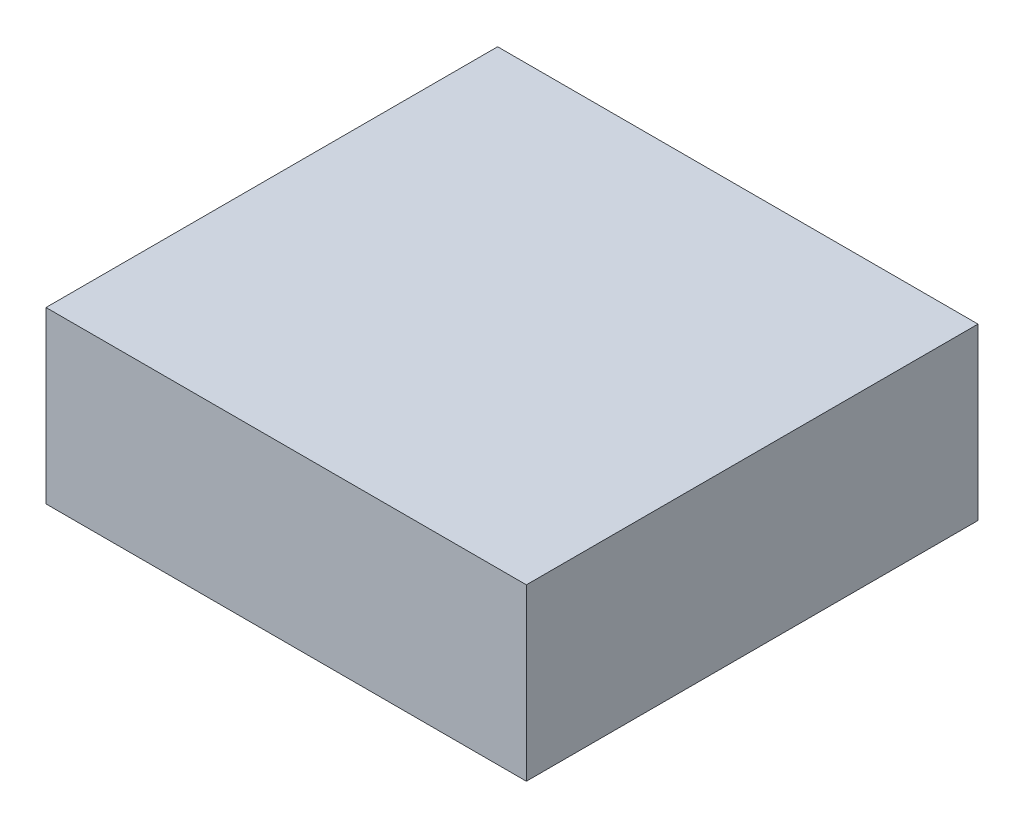
ISO-10303-21;
HEADER;
FILE_DESCRIPTION(('STEP AP214'),'2;1');
FILE_NAME('part.step','',(''),(''),'','','');
FILE_SCHEMA(('AUTOMOTIVE_DESIGN { 1 0 10303 214 1 1 1 1 }'));
ENDSEC;
DATA;
#1=APPLICATION_CONTEXT('core data for automotive mechanical design processes');
#2=APPLICATION_PROTOCOL_DEFINITION('international standard','automotive_design',2000,#1);
#3=PRODUCT_CONTEXT('',#1,'mechanical');
#4=PRODUCT('Part','Part','',(#3));
#5=PRODUCT_RELATED_PRODUCT_CATEGORY('part','',(#4));
#6=PRODUCT_DEFINITION_FORMATION('','',#4);
#7=PRODUCT_DEFINITION_CONTEXT('part definition',#1,'design');
#8=PRODUCT_DEFINITION('design','',#6,#7);
#9=PRODUCT_DEFINITION_SHAPE('','',#8);
#10=(LENGTH_UNIT() NAMED_UNIT(*) SI_UNIT(.MILLI.,.METRE.));
#11=(NAMED_UNIT(*) PLANE_ANGLE_UNIT() SI_UNIT($,.RADIAN.));
#12=(NAMED_UNIT(*) SI_UNIT($,.STERADIAN.) SOLID_ANGLE_UNIT());
#13=UNCERTAINTY_MEASURE_WITH_UNIT(LENGTH_MEASURE(1.E-05),#10,'distance_accuracy_value','');
#14=(GEOMETRIC_REPRESENTATION_CONTEXT(3) GLOBAL_UNCERTAINTY_ASSIGNED_CONTEXT((#13)) GLOBAL_UNIT_ASSIGNED_CONTEXT((#10,
#11,#12)) REPRESENTATION_CONTEXT('',''));
#15=CARTESIAN_POINT('',(0.,0.,0.));
#16=DIRECTION('',(0.,0.,1.));
#17=DIRECTION('',(1.,0.,0.));
#18=AXIS2_PLACEMENT_3D('',#15,#16,#17);
#19=CARTESIAN_POINT('',(53.1815925286087,-18.8342802614234,-50.));
#20=DIRECTION('',(1.,0.,0.));
#21=DIRECTION('',(0.,0.,-1.));
#22=AXIS2_PLACEMENT_3D('',#19,#20,#21);
#23=PLANE('',#22);
#24=DIRECTION('',(0.,1.,0.));
#25=VECTOR('',#24,1.);
#26=CARTESIAN_POINT('',(53.1815925286087,-18.8342802614234,50.));
#27=LINE('',#26,#25);
#28=CARTESIAN_POINT('',(53.1815925286087,-18.8342802614234,50.));
#29=VERTEX_POINT('',#28);
#30=CARTESIAN_POINT('',(53.1815925286087,18.8342802614234,50.));
#31=VERTEX_POINT('',#30);
#32=EDGE_CURVE('E104',#29,#31,#27,.T.);
#33=ORIENTED_EDGE('',*,*,#32,.F.);
#34=DIRECTION('',(0.,0.,1.));
#35=VECTOR('',#34,1.);
#36=CARTESIAN_POINT('',(53.1815925286087,-18.8342802614234,-50.));
#37=LINE('',#36,#35);
#38=CARTESIAN_POINT('',(53.1815925286087,-18.8342802614234,-50.));
#39=VERTEX_POINT('',#38);
#40=EDGE_CURVE('E11',#39,#29,#37,.T.);
#41=ORIENTED_EDGE('',*,*,#40,.F.);
#42=DIRECTION('',(0.,1.,0.));
#43=VECTOR('',#42,1.);
#44=CARTESIAN_POINT('',(53.1815925286087,-18.8342802614234,-50.));
#45=LINE('',#44,#43);
#46=CARTESIAN_POINT('',(53.1815925286087,18.8342802614234,-50.));
#47=VERTEX_POINT('',#46);
#48=EDGE_CURVE('E98',#39,#47,#45,.T.);
#49=ORIENTED_EDGE('',*,*,#48,.T.);
#50=DIRECTION('',(0.,0.,1.));
#51=VECTOR('',#50,1.);
#52=CARTESIAN_POINT('',(53.1815925286087,18.8342802614234,-50.));
#53=LINE('',#52,#51);
#54=EDGE_CURVE('E43',#47,#31,#53,.T.);
#55=ORIENTED_EDGE('',*,*,#54,.T.);
#56=EDGE_LOOP('',(#33,#41,#49,#55));
#57=FACE_BOUND('',#56,.T.);
#58=ADVANCED_FACE('F40',(#57),#23,.T.);
#59=CARTESIAN_POINT('',(-53.1815925286088,-18.8342802614234,-50.));
#60=DIRECTION('',(0.,-1.,0.));
#61=DIRECTION('',(0.,0.,-1.));
#62=AXIS2_PLACEMENT_3D('',#59,#60,#61);
#63=PLANE('',#62);
#64=DIRECTION('',(1.,0.,0.));
#65=VECTOR('',#64,1.);
#66=CARTESIAN_POINT('',(-53.1815925286088,-18.8342802614234,50.));
#67=LINE('',#66,#65);
#68=CARTESIAN_POINT('',(-53.1815925286088,-18.8342802614234,50.));
#69=VERTEX_POINT('',#68);
#70=EDGE_CURVE('E100',#69,#29,#67,.T.);
#71=ORIENTED_EDGE('',*,*,#70,.F.);
#72=DIRECTION('',(0.,0.,1.));
#73=VECTOR('',#72,1.);
#74=CARTESIAN_POINT('',(-53.1815925286088,-18.8342802614234,-50.));
#75=LINE('',#74,#73);
#76=CARTESIAN_POINT('',(-53.1815925286088,-18.8342802614234,-50.));
#77=VERTEX_POINT('',#76);
#78=EDGE_CURVE('E49',#77,#69,#75,.T.);
#79=ORIENTED_EDGE('',*,*,#78,.F.);
#80=DIRECTION('',(1.,0.,0.));
#81=VECTOR('',#80,1.);
#82=CARTESIAN_POINT('',(-53.1815925286088,-18.8342802614234,-50.));
#83=LINE('',#82,#81);
#84=EDGE_CURVE('E95',#77,#39,#83,.T.);
#85=ORIENTED_EDGE('',*,*,#84,.T.);
#86=ORIENTED_EDGE('',*,*,#40,.T.);
#87=EDGE_LOOP('',(#71,#79,#85,#86));
#88=FACE_BOUND('',#87,.T.);
#89=ADVANCED_FACE('F114',(#88),#63,.T.);
#90=CARTESIAN_POINT('',(-53.1815925286088,-18.8342802614234,-50.));
#91=DIRECTION('',(-1.,0.,0.));
#92=DIRECTION('',(0.,0.,1.));
#93=AXIS2_PLACEMENT_3D('',#90,#91,#92);
#94=PLANE('',#93);
#95=DIRECTION('',(0.,-1.,0.));
#96=VECTOR('',#95,1.);
#97=CARTESIAN_POINT('',(-53.1815925286088,-18.8342802614234,50.));
#98=LINE('',#97,#96);
#99=CARTESIAN_POINT('',(-53.1815925286088,18.8342802614234,50.));
#100=VERTEX_POINT('',#99);
#101=EDGE_CURVE('E90',#100,#69,#98,.T.);
#102=ORIENTED_EDGE('',*,*,#101,.F.);
#103=DIRECTION('',(0.,0.,1.));
#104=VECTOR('',#103,1.);
#105=CARTESIAN_POINT('',(-53.1815925286088,18.8342802614234,-50.));
#106=LINE('',#105,#104);
#107=CARTESIAN_POINT('',(-53.1815925286088,18.8342802614234,-50.));
#108=VERTEX_POINT('',#107);
#109=EDGE_CURVE('E85',#108,#100,#106,.T.);
#110=ORIENTED_EDGE('',*,*,#109,.F.);
#111=DIRECTION('',(0.,-1.,0.));
#112=VECTOR('',#111,1.);
#113=CARTESIAN_POINT('',(-53.1815925286088,-18.8342802614234,-50.));
#114=LINE('',#113,#112);
#115=EDGE_CURVE('E88',#108,#77,#114,.T.);
#116=ORIENTED_EDGE('',*,*,#115,.T.);
#117=ORIENTED_EDGE('',*,*,#78,.T.);
#118=EDGE_LOOP('',(#102,#110,#116,#117));
#119=FACE_BOUND('',#118,.T.);
#120=ADVANCED_FACE('F87',(#119),#94,.T.);
#121=CARTESIAN_POINT('',(-53.1815925286088,18.8342802614234,-50.));
#122=DIRECTION('',(0.,1.,0.));
#123=DIRECTION('',(0.,0.,1.));
#124=AXIS2_PLACEMENT_3D('',#121,#122,#123);
#125=PLANE('',#124);
#126=DIRECTION('',(-1.,0.,0.));
#127=VECTOR('',#126,1.);
#128=CARTESIAN_POINT('',(-53.1815925286088,18.8342802614234,50.));
#129=LINE('',#128,#127);
#130=EDGE_CURVE('E107',#31,#100,#129,.T.);
#131=ORIENTED_EDGE('',*,*,#130,.F.);
#132=ORIENTED_EDGE('',*,*,#54,.F.);
#133=DIRECTION('',(-1.,0.,0.));
#134=VECTOR('',#133,1.);
#135=CARTESIAN_POINT('',(-53.1815925286088,18.8342802614234,-50.));
#136=LINE('',#135,#134);
#137=EDGE_CURVE('E94',#47,#108,#136,.T.);
#138=ORIENTED_EDGE('',*,*,#137,.T.);
#139=ORIENTED_EDGE('',*,*,#109,.T.);
#140=EDGE_LOOP('',(#131,#132,#138,#139));
#141=FACE_BOUND('',#140,.T.);
#142=ADVANCED_FACE('F97',(#141),#125,.T.);
#143=CARTESIAN_POINT('',(0.,0.,-50.));
#144=DIRECTION('',(0.,0.,-1.));
#145=DIRECTION('',(-1.,0.,0.));
#146=AXIS2_PLACEMENT_3D('',#143,#144,#145);
#147=PLANE('',#146);
#148=ORIENTED_EDGE('',*,*,#48,.F.);
#149=ORIENTED_EDGE('',*,*,#84,.F.);
#150=ORIENTED_EDGE('',*,*,#115,.F.);
#151=ORIENTED_EDGE('',*,*,#137,.F.);
#152=EDGE_LOOP('',(#148,#149,#150,#151));
#153=FACE_BOUND('',#152,.T.);
#154=ADVANCED_FACE('F93',(#153),#147,.T.);
#155=CARTESIAN_POINT('',(0.,0.,50.));
#156=DIRECTION('',(0.,0.,-1.));
#157=DIRECTION('',(-1.,0.,0.));
#158=AXIS2_PLACEMENT_3D('',#155,#156,#157);
#159=PLANE('',#158);
#160=ORIENTED_EDGE('',*,*,#32,.T.);
#161=ORIENTED_EDGE('',*,*,#130,.T.);
#162=ORIENTED_EDGE('',*,*,#101,.T.);
#163=ORIENTED_EDGE('',*,*,#70,.T.);
#164=EDGE_LOOP('',(#160,#161,#162,#163));
#165=FACE_BOUND('',#164,.T.);
#166=ADVANCED_FACE('F113',(#165),#159,.F.);
#167=CLOSED_SHELL('',(#58,#89,#120,#142,#154,#166));
#168=MANIFOLD_SOLID_BREP('B2',#167);
#169=ADVANCED_BREP_SHAPE_REPRESENTATION('',(#18,#168),#14);
#170=SHAPE_DEFINITION_REPRESENTATION(#9,#169);
ENDSEC;
END-ISO-10303-21;
